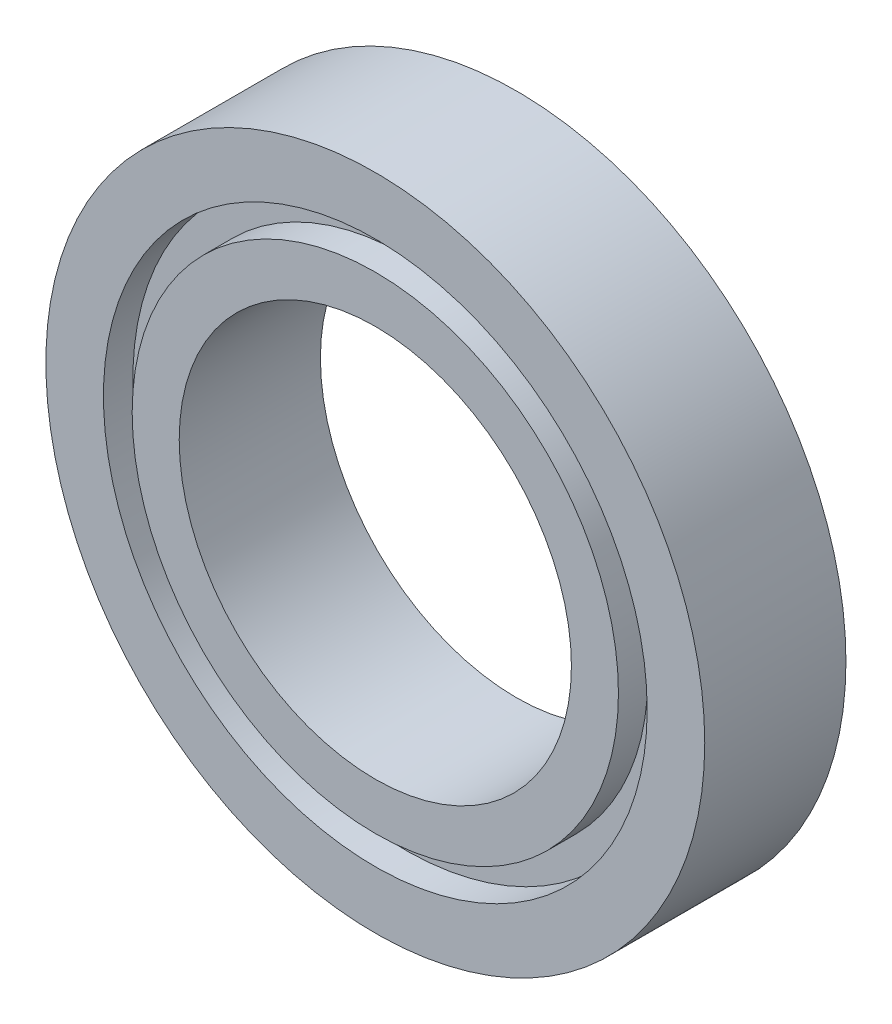
ISO-10303-21;
HEADER;
FILE_DESCRIPTION(('STEP AP214'),'2;1');
FILE_NAME('part.step','',(''),(''),'','','');
FILE_SCHEMA(('AUTOMOTIVE_DESIGN { 1 0 10303 214 1 1 1 1 }'));
ENDSEC;
DATA;
#1=APPLICATION_CONTEXT('core data for automotive mechanical design processes');
#2=APPLICATION_PROTOCOL_DEFINITION('international standard','automotive_design',2000,#1);
#3=PRODUCT_CONTEXT('',#1,'mechanical');
#4=PRODUCT('Part','Part','',(#3));
#5=PRODUCT_RELATED_PRODUCT_CATEGORY('part','',(#4));
#6=PRODUCT_DEFINITION_FORMATION('','',#4);
#7=PRODUCT_DEFINITION_CONTEXT('part definition',#1,'design');
#8=PRODUCT_DEFINITION('design','',#6,#7);
#9=PRODUCT_DEFINITION_SHAPE('','',#8);
#10=(LENGTH_UNIT() NAMED_UNIT(*) SI_UNIT(.MILLI.,.METRE.));
#11=(NAMED_UNIT(*) PLANE_ANGLE_UNIT() SI_UNIT($,.RADIAN.));
#12=(NAMED_UNIT(*) SI_UNIT($,.STERADIAN.) SOLID_ANGLE_UNIT());
#13=UNCERTAINTY_MEASURE_WITH_UNIT(LENGTH_MEASURE(1.E-05),#10,'distance_accuracy_value','');
#14=(GEOMETRIC_REPRESENTATION_CONTEXT(3) GLOBAL_UNCERTAINTY_ASSIGNED_CONTEXT((#13)) GLOBAL_UNIT_ASSIGNED_CONTEXT((#10,
#11,#12)) REPRESENTATION_CONTEXT('',''));
#15=CARTESIAN_POINT('',(0.,0.,0.));
#16=DIRECTION('',(0.,0.,1.));
#17=DIRECTION('',(1.,0.,0.));
#18=AXIS2_PLACEMENT_3D('',#15,#16,#17);
#19=CARTESIAN_POINT('',(0.,0.,-4.5));
#20=DIRECTION('',(0.,0.,1.));
#21=DIRECTION('',(1.,0.,0.));
#22=AXIS2_PLACEMENT_3D('',#19,#20,#21);
#23=PLANE('',#22);
#24=CARTESIAN_POINT('',(0.,0.,-4.5));
#25=DIRECTION('',(0.,0.,1.));
#26=DIRECTION('',(1.,0.,0.));
#27=AXIS2_PLACEMENT_3D('',#24,#25,#26);
#28=CIRCLE('',#27,12.5);
#29=CARTESIAN_POINT('',(12.5,0.,-4.5));
#30=VERTEX_POINT('',#29);
#31=EDGE_CURVE('E49',#30,#30,#28,.T.);
#32=ORIENTED_EDGE('',*,*,#31,.T.);
#33=EDGE_LOOP('',(#32));
#34=FACE_BOUND('',#33,.T.);
#35=CARTESIAN_POINT('',(0.,0.,-4.5));
#36=DIRECTION('',(0.,0.,1.));
#37=DIRECTION('',(1.,0.,0.));
#38=AXIS2_PLACEMENT_3D('',#35,#36,#37);
#39=CIRCLE('',#38,15.4980961096746);
#40=CARTESIAN_POINT('',(15.4980961096746,0.,-4.5));
#41=VERTEX_POINT('',#40);
#42=EDGE_CURVE('E83',#41,#41,#39,.T.);
#43=ORIENTED_EDGE('',*,*,#42,.F.);
#44=EDGE_LOOP('',(#43));
#45=FACE_BOUND('',#44,.T.);
#46=ADVANCED_FACE('F33',(#34,#45),#23,.F.);
#47=CARTESIAN_POINT('',(0.,0.,-4.5));
#48=DIRECTION('',(0.,0.,1.));
#49=DIRECTION('',(1.,0.,0.));
#50=AXIS2_PLACEMENT_3D('',#47,#48,#49);
#51=CIRCLE('',#50,21.);
#52=CARTESIAN_POINT('',(21.,0.,-4.5));
#53=VERTEX_POINT('',#52);
#54=EDGE_CURVE('E37',#53,#53,#51,.T.);
#55=ORIENTED_EDGE('',*,*,#54,.F.);
#56=EDGE_LOOP('',(#55));
#57=FACE_BOUND('',#56,.T.);
#58=CARTESIAN_POINT('',(0.,0.,-4.5));
#59=DIRECTION('',(0.,0.,1.));
#60=DIRECTION('',(1.,0.,0.));
#61=AXIS2_PLACEMENT_3D('',#58,#59,#60);
#62=CIRCLE('',#61,17.3301127162425);
#63=CARTESIAN_POINT('',(17.3301127162425,0.,-4.5));
#64=VERTEX_POINT('',#63);
#65=EDGE_CURVE('E79',#64,#64,#62,.T.);
#66=ORIENTED_EDGE('',*,*,#65,.T.);
#67=EDGE_LOOP('',(#66));
#68=FACE_BOUND('',#67,.T.);
#69=ADVANCED_FACE('F92',(#57,#68),#23,.F.);
#70=CARTESIAN_POINT('',(0.,0.,4.5));
#71=DIRECTION('',(0.,0.,1.));
#72=DIRECTION('',(1.,0.,0.));
#73=AXIS2_PLACEMENT_3D('',#70,#71,#72);
#74=PLANE('',#73);
#75=CARTESIAN_POINT('',(0.,0.,4.5));
#76=DIRECTION('',(0.,0.,1.));
#77=DIRECTION('',(1.,0.,0.));
#78=AXIS2_PLACEMENT_3D('',#75,#76,#77);
#79=CIRCLE('',#78,21.);
#80=CARTESIAN_POINT('',(21.,0.,4.5));
#81=VERTEX_POINT('',#80);
#82=EDGE_CURVE('E10',#81,#81,#79,.T.);
#83=ORIENTED_EDGE('',*,*,#82,.T.);
#84=EDGE_LOOP('',(#83));
#85=FACE_BOUND('',#84,.T.);
#86=CARTESIAN_POINT('',(0.,0.,4.5));
#87=DIRECTION('',(0.,0.,1.));
#88=DIRECTION('',(1.,0.,0.));
#89=AXIS2_PLACEMENT_3D('',#86,#87,#88);
#90=CIRCLE('',#89,17.3301127162425);
#91=CARTESIAN_POINT('',(17.3301127162425,0.,4.5));
#92=VERTEX_POINT('',#91);
#93=EDGE_CURVE('E53',#92,#92,#90,.T.);
#94=ORIENTED_EDGE('',*,*,#93,.F.);
#95=EDGE_LOOP('',(#94));
#96=FACE_BOUND('',#95,.T.);
#97=ADVANCED_FACE('F97',(#85,#96),#74,.T.);
#98=CARTESIAN_POINT('',(0.,0.,4.5));
#99=DIRECTION('',(0.,0.,1.));
#100=DIRECTION('',(1.,0.,0.));
#101=AXIS2_PLACEMENT_3D('',#98,#99,#100);
#102=CIRCLE('',#101,12.5);
#103=CARTESIAN_POINT('',(12.5,0.,4.5));
#104=VERTEX_POINT('',#103);
#105=EDGE_CURVE('E47',#104,#104,#102,.T.);
#106=ORIENTED_EDGE('',*,*,#105,.F.);
#107=EDGE_LOOP('',(#106));
#108=FACE_BOUND('',#107,.T.);
#109=CARTESIAN_POINT('',(0.,0.,4.5));
#110=DIRECTION('',(0.,0.,1.));
#111=DIRECTION('',(1.,0.,0.));
#112=AXIS2_PLACEMENT_3D('',#109,#110,#111);
#113=CIRCLE('',#112,15.4980961096746);
#114=CARTESIAN_POINT('',(15.4980961096746,0.,4.5));
#115=VERTEX_POINT('',#114);
#116=EDGE_CURVE('E67',#115,#115,#113,.T.);
#117=ORIENTED_EDGE('',*,*,#116,.T.);
#118=EDGE_LOOP('',(#117));
#119=FACE_BOUND('',#118,.T.);
#120=ADVANCED_FACE('F102',(#108,#119),#74,.T.);
#121=CARTESIAN_POINT('',(0.,0.,4.5));
#122=DIRECTION('',(0.,0.,-1.));
#123=DIRECTION('',(-1.,0.,0.));
#124=AXIS2_PLACEMENT_3D('',#121,#122,#123);
#125=CYLINDRICAL_SURFACE('',#124,21.);
#126=ORIENTED_EDGE('',*,*,#82,.F.);
#127=EDGE_LOOP('',(#126));
#128=FACE_BOUND('',#127,.T.);
#129=ORIENTED_EDGE('',*,*,#54,.T.);
#130=EDGE_LOOP('',(#129));
#131=FACE_BOUND('',#130,.T.);
#132=ADVANCED_FACE('F35',(#128,#131),#125,.T.);
#133=CARTESIAN_POINT('',(0.,0.,4.5));
#134=DIRECTION('',(0.,0.,-1.));
#135=DIRECTION('',(-1.,0.,0.));
#136=AXIS2_PLACEMENT_3D('',#133,#134,#135);
#137=CYLINDRICAL_SURFACE('',#136,12.5);
#138=ORIENTED_EDGE('',*,*,#105,.T.);
#139=EDGE_LOOP('',(#138));
#140=FACE_BOUND('',#139,.T.);
#141=ORIENTED_EDGE('',*,*,#31,.F.);
#142=EDGE_LOOP('',(#141));
#143=FACE_BOUND('',#142,.T.);
#144=ADVANCED_FACE('F103',(#140,#143),#137,.F.);
#145=CARTESIAN_POINT('',(0.,0.,0.));
#146=DIRECTION('',(0.,0.,1.));
#147=DIRECTION('',(1.,0.,0.));
#148=AXIS2_PLACEMENT_3D('',#145,#146,#147);
#149=CYLINDRICAL_SURFACE('',#148,17.3301127162425);
#150=ORIENTED_EDGE('',*,*,#93,.T.);
#151=EDGE_LOOP('',(#150));
#152=FACE_BOUND('',#151,.T.);
#153=CARTESIAN_POINT('',(0.,0.,2.62435073559293));
#154=DIRECTION('',(0.,0.,1.));
#155=DIRECTION('',(1.,0.,0.));
#156=AXIS2_PLACEMENT_3D('',#153,#154,#155);
#157=CIRCLE('',#156,17.3301127162425);
#158=CARTESIAN_POINT('',(17.3301127162425,0.,2.62435073559293));
#159=VERTEX_POINT('',#158);
#160=EDGE_CURVE('E59',#159,#159,#157,.T.);
#161=ORIENTED_EDGE('',*,*,#160,.F.);
#162=EDGE_LOOP('',(#161));
#163=FACE_BOUND('',#162,.T.);
#164=ADVANCED_FACE('F106',(#152,#163),#149,.F.);
#165=CARTESIAN_POINT('',(0.,15.4980961096746,2.62435073559293));
#166=DIRECTION('',(0.,0.,1.));
#167=DIRECTION('',(1.,0.,0.));
#168=AXIS2_PLACEMENT_3D('',#165,#166,#167);
#169=PLANE('',#168);
#170=ORIENTED_EDGE('',*,*,#160,.T.);
#171=EDGE_LOOP('',(#170));
#172=FACE_BOUND('',#171,.T.);
#173=CARTESIAN_POINT('',(0.,0.,2.62435073559293));
#174=DIRECTION('',(0.,0.,1.));
#175=DIRECTION('',(1.,0.,0.));
#176=AXIS2_PLACEMENT_3D('',#173,#174,#175);
#177=CIRCLE('',#176,15.4980961096746);
#178=CARTESIAN_POINT('',(15.4980961096746,0.,2.62435073559293));
#179=VERTEX_POINT('',#178);
#180=EDGE_CURVE('E63',#179,#179,#177,.T.);
#181=ORIENTED_EDGE('',*,*,#180,.F.);
#182=EDGE_LOOP('',(#181));
#183=FACE_BOUND('',#182,.T.);
#184=ADVANCED_FACE('F110',(#172,#183),#169,.T.);
#185=CARTESIAN_POINT('',(0.,0.,0.));
#186=DIRECTION('',(0.,0.,1.));
#187=DIRECTION('',(1.,0.,0.));
#188=AXIS2_PLACEMENT_3D('',#185,#186,#187);
#189=CYLINDRICAL_SURFACE('',#188,15.4980961096746);
#190=ORIENTED_EDGE('',*,*,#180,.T.);
#191=EDGE_LOOP('',(#190));
#192=FACE_BOUND('',#191,.T.);
#193=ORIENTED_EDGE('',*,*,#116,.F.);
#194=EDGE_LOOP('',(#193));
#195=FACE_BOUND('',#194,.T.);
#196=ADVANCED_FACE('F114',(#192,#195),#189,.T.);
#197=CARTESIAN_POINT('',(0.,0.,0.));
#198=DIRECTION('',(0.,0.,1.));
#199=DIRECTION('',(1.,0.,0.));
#200=AXIS2_PLACEMENT_3D('',#197,#198,#199);
#201=CYLINDRICAL_SURFACE('',#200,15.4980961096746);
#202=ORIENTED_EDGE('',*,*,#42,.T.);
#203=EDGE_LOOP('',(#202));
#204=FACE_BOUND('',#203,.T.);
#205=CARTESIAN_POINT('',(0.,0.,-2.62435073559293));
#206=DIRECTION('',(0.,0.,1.));
#207=DIRECTION('',(1.,0.,0.));
#208=AXIS2_PLACEMENT_3D('',#205,#206,#207);
#209=CIRCLE('',#208,15.4980961096746);
#210=CARTESIAN_POINT('',(15.4980961096746,0.,-2.62435073559293));
#211=VERTEX_POINT('',#210);
#212=EDGE_CURVE('E71',#211,#211,#209,.T.);
#213=ORIENTED_EDGE('',*,*,#212,.F.);
#214=EDGE_LOOP('',(#213));
#215=FACE_BOUND('',#214,.T.);
#216=ADVANCED_FACE('F88',(#204,#215),#201,.T.);
#217=CARTESIAN_POINT('',(0.,15.4980961096746,-2.62435073559293));
#218=DIRECTION('',(0.,0.,-1.));
#219=DIRECTION('',(-1.,0.,0.));
#220=AXIS2_PLACEMENT_3D('',#217,#218,#219);
#221=PLANE('',#220);
#222=ORIENTED_EDGE('',*,*,#212,.T.);
#223=EDGE_LOOP('',(#222));
#224=FACE_BOUND('',#223,.T.);
#225=CARTESIAN_POINT('',(0.,0.,-2.62435073559293));
#226=DIRECTION('',(0.,0.,1.));
#227=DIRECTION('',(1.,0.,0.));
#228=AXIS2_PLACEMENT_3D('',#225,#226,#227);
#229=CIRCLE('',#228,17.3301127162425);
#230=CARTESIAN_POINT('',(17.3301127162425,0.,-2.62435073559293));
#231=VERTEX_POINT('',#230);
#232=EDGE_CURVE('E75',#231,#231,#229,.T.);
#233=ORIENTED_EDGE('',*,*,#232,.F.);
#234=EDGE_LOOP('',(#233));
#235=FACE_BOUND('',#234,.T.);
#236=ADVANCED_FACE('F121',(#224,#235),#221,.T.);
#237=CARTESIAN_POINT('',(0.,0.,0.));
#238=DIRECTION('',(0.,0.,1.));
#239=DIRECTION('',(1.,0.,0.));
#240=AXIS2_PLACEMENT_3D('',#237,#238,#239);
#241=CYLINDRICAL_SURFACE('',#240,17.3301127162425);
#242=ORIENTED_EDGE('',*,*,#232,.T.);
#243=EDGE_LOOP('',(#242));
#244=FACE_BOUND('',#243,.T.);
#245=ORIENTED_EDGE('',*,*,#65,.F.);
#246=EDGE_LOOP('',(#245));
#247=FACE_BOUND('',#246,.T.);
#248=ADVANCED_FACE('F124',(#244,#247),#241,.F.);
#249=CLOSED_SHELL('',(#46,#69,#97,#120,#132,#144,#164,#184,#196,#216,#236,#248));
#250=MANIFOLD_SOLID_BREP('B2',#249);
#251=ADVANCED_BREP_SHAPE_REPRESENTATION('',(#18,#250),#14);
#252=SHAPE_DEFINITION_REPRESENTATION(#9,#251);
ENDSEC;
END-ISO-10303-21;
